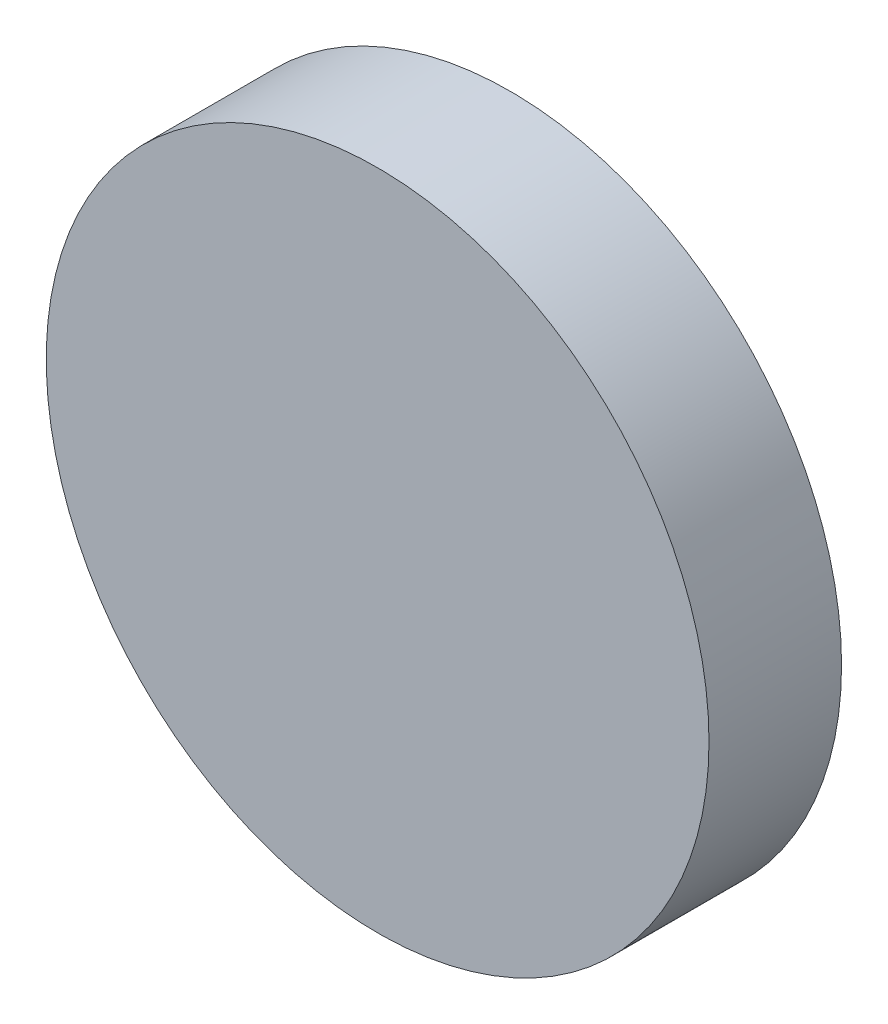
ISO-10303-21;
HEADER;
FILE_DESCRIPTION(('STEP AP214'),'2;1');
FILE_NAME('part.step','',(''),(''),'','','');
FILE_SCHEMA(('AUTOMOTIVE_DESIGN { 1 0 10303 214 1 1 1 1 }'));
ENDSEC;
DATA;
#1=APPLICATION_CONTEXT('core data for automotive mechanical design processes');
#2=APPLICATION_PROTOCOL_DEFINITION('international standard','automotive_design',2000,#1);
#3=PRODUCT_CONTEXT('',#1,'mechanical');
#4=PRODUCT('Part','Part','',(#3));
#5=PRODUCT_RELATED_PRODUCT_CATEGORY('part','',(#4));
#6=PRODUCT_DEFINITION_FORMATION('','',#4);
#7=PRODUCT_DEFINITION_CONTEXT('part definition',#1,'design');
#8=PRODUCT_DEFINITION('design','',#6,#7);
#9=PRODUCT_DEFINITION_SHAPE('','',#8);
#10=(LENGTH_UNIT() NAMED_UNIT(*) SI_UNIT(.MILLI.,.METRE.));
#11=(NAMED_UNIT(*) PLANE_ANGLE_UNIT() SI_UNIT($,.RADIAN.));
#12=(NAMED_UNIT(*) SI_UNIT($,.STERADIAN.) SOLID_ANGLE_UNIT());
#13=UNCERTAINTY_MEASURE_WITH_UNIT(LENGTH_MEASURE(1.E-05),#10,'distance_accuracy_value','');
#14=(GEOMETRIC_REPRESENTATION_CONTEXT(3) GLOBAL_UNCERTAINTY_ASSIGNED_CONTEXT((#13)) GLOBAL_UNIT_ASSIGNED_CONTEXT((#10,
#11,#12)) REPRESENTATION_CONTEXT('',''));
#15=CARTESIAN_POINT('',(0.,0.,0.));
#16=DIRECTION('',(0.,0.,1.));
#17=DIRECTION('',(1.,0.,0.));
#18=AXIS2_PLACEMENT_3D('',#15,#16,#17);
#19=CARTESIAN_POINT('',(0.,0.,30.));
#20=DIRECTION('',(0.,0.,-1.));
#21=DIRECTION('',(-1.,0.,0.));
#22=AXIS2_PLACEMENT_3D('',#19,#20,#21);
#23=CYLINDRICAL_SURFACE('',#22,75.);
#24=CARTESIAN_POINT('',(0.,0.,30.));
#25=DIRECTION('',(0.,0.,1.));
#26=DIRECTION('',(1.,0.,0.));
#27=AXIS2_PLACEMENT_3D('',#24,#25,#26);
#28=CIRCLE('',#27,75.);
#29=CARTESIAN_POINT('',(75.,0.,30.));
#30=VERTEX_POINT('',#29);
#31=EDGE_CURVE('E10',#30,#30,#28,.T.);
#32=ORIENTED_EDGE('',*,*,#31,.F.);
#33=EDGE_LOOP('',(#32));
#34=FACE_BOUND('',#33,.T.);
#35=CARTESIAN_POINT('',(0.,0.,0.));
#36=DIRECTION('',(0.,0.,1.));
#37=DIRECTION('',(1.,0.,0.));
#38=AXIS2_PLACEMENT_3D('',#35,#36,#37);
#39=CIRCLE('',#38,75.);
#40=CARTESIAN_POINT('',(75.,0.,0.));
#41=VERTEX_POINT('',#40);
#42=EDGE_CURVE('E35',#41,#41,#39,.T.);
#43=ORIENTED_EDGE('',*,*,#42,.T.);
#44=EDGE_LOOP('',(#43));
#45=FACE_BOUND('',#44,.T.);
#46=ADVANCED_FACE('F32',(#34,#45),#23,.T.);
#47=CARTESIAN_POINT('',(0.,0.,30.));
#48=DIRECTION('',(0.,0.,1.));
#49=DIRECTION('',(1.,0.,0.));
#50=AXIS2_PLACEMENT_3D('',#47,#48,#49);
#51=PLANE('',#50);
#52=ORIENTED_EDGE('',*,*,#31,.T.);
#53=EDGE_LOOP('',(#52));
#54=FACE_BOUND('',#53,.T.);
#55=ADVANCED_FACE('F47',(#54),#51,.T.);
#56=CARTESIAN_POINT('',(0.,0.,0.));
#57=DIRECTION('',(0.,0.,1.));
#58=DIRECTION('',(1.,0.,0.));
#59=AXIS2_PLACEMENT_3D('',#56,#57,#58);
#60=PLANE('',#59);
#61=ORIENTED_EDGE('',*,*,#42,.F.);
#62=EDGE_LOOP('',(#61));
#63=FACE_BOUND('',#62,.T.);
#64=ADVANCED_FACE('F45',(#63),#60,.F.);
#65=CLOSED_SHELL('',(#46,#55,#64));
#66=MANIFOLD_SOLID_BREP('B2',#65);
#67=ADVANCED_BREP_SHAPE_REPRESENTATION('',(#18,#66),#14);
#68=SHAPE_DEFINITION_REPRESENTATION(#9,#67);
ENDSEC;
END-ISO-10303-21;
